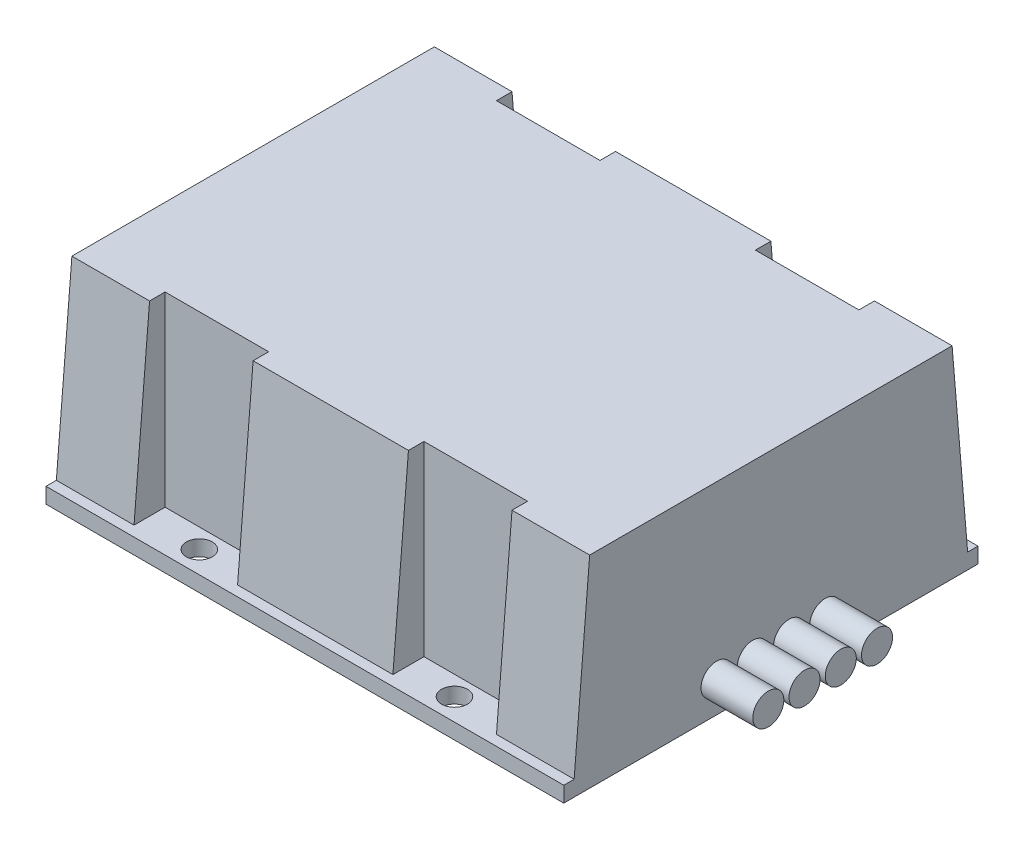
ISO-10303-21;
HEADER;
FILE_DESCRIPTION(('STEP AP214'),'2;1');
FILE_NAME('part.step','',(''),(''),'','','');
FILE_SCHEMA(('AUTOMOTIVE_DESIGN { 1 0 10303 214 1 1 1 1 }'));
ENDSEC;
DATA;
#1=APPLICATION_CONTEXT('core data for automotive mechanical design processes');
#2=APPLICATION_PROTOCOL_DEFINITION('international standard','automotive_design',2000,#1);
#3=PRODUCT_CONTEXT('',#1,'mechanical');
#4=PRODUCT('Part','Part','',(#3));
#5=PRODUCT_RELATED_PRODUCT_CATEGORY('part','',(#4));
#6=PRODUCT_DEFINITION_FORMATION('','',#4);
#7=PRODUCT_DEFINITION_CONTEXT('part definition',#1,'design');
#8=PRODUCT_DEFINITION('design','',#6,#7);
#9=PRODUCT_DEFINITION_SHAPE('','',#8);
#10=(LENGTH_UNIT() NAMED_UNIT(*) SI_UNIT(.MILLI.,.METRE.));
#11=(NAMED_UNIT(*) PLANE_ANGLE_UNIT() SI_UNIT($,.RADIAN.));
#12=(NAMED_UNIT(*) SI_UNIT($,.STERADIAN.) SOLID_ANGLE_UNIT());
#13=UNCERTAINTY_MEASURE_WITH_UNIT(LENGTH_MEASURE(1.E-05),#10,'distance_accuracy_value','');
#14=(GEOMETRIC_REPRESENTATION_CONTEXT(3) GLOBAL_UNCERTAINTY_ASSIGNED_CONTEXT((#13)) GLOBAL_UNIT_ASSIGNED_CONTEXT((#10,
#11,#12)) REPRESENTATION_CONTEXT('',''));
#15=CARTESIAN_POINT('',(0.,0.,0.));
#16=DIRECTION('',(0.,0.,1.));
#17=DIRECTION('',(1.,0.,0.));
#18=AXIS2_PLACEMENT_3D('',#15,#16,#17);
#19=CARTESIAN_POINT('',(0.,39.,0.));
#20=DIRECTION('',(0.,1.,0.));
#21=DIRECTION('',(0.,0.,1.));
#22=AXIS2_PLACEMENT_3D('',#19,#20,#21);
#23=PLANE('',#22);
#24=DIRECTION('',(1.,0.,0.));
#25=VECTOR('',#24,1.);
#26=CARTESIAN_POINT('',(0.,39.,72.));
#27=LINE('',#26,#25);
#28=CARTESIAN_POINT('',(15.,39.,72.));
#29=VERTEX_POINT('',#28);
#30=CARTESIAN_POINT('',(35.,39.,72.));
#31=VERTEX_POINT('',#30);
#32=EDGE_CURVE('E218',#29,#31,#27,.T.);
#33=ORIENTED_EDGE('',*,*,#32,.T.);
#34=DIRECTION('',(0.,0.,1.));
#35=VECTOR('',#34,1.);
#36=CARTESIAN_POINT('',(35.,39.,0.));
#37=LINE('',#36,#35);
#38=CARTESIAN_POINT('',(35.,39.,75.));
#39=VERTEX_POINT('',#38);
#40=EDGE_CURVE('E212',#31,#39,#37,.T.);
#41=ORIENTED_EDGE('',*,*,#40,.T.);
#42=DIRECTION('',(1.,0.,0.));
#43=VECTOR('',#42,1.);
#44=CARTESIAN_POINT('',(0.,39.,75.));
#45=LINE('',#44,#43);
#46=CARTESIAN_POINT('',(65.,39.,75.));
#47=VERTEX_POINT('',#46);
#48=EDGE_CURVE('E386',#39,#47,#45,.T.);
#49=ORIENTED_EDGE('',*,*,#48,.T.);
#50=DIRECTION('',(0.,0.,1.));
#51=VECTOR('',#50,1.);
#52=CARTESIAN_POINT('',(65.,39.,0.));
#53=LINE('',#52,#51);
#54=CARTESIAN_POINT('',(65.,39.,72.));
#55=VERTEX_POINT('',#54);
#56=EDGE_CURVE('E232',#55,#47,#53,.T.);
#57=ORIENTED_EDGE('',*,*,#56,.F.);
#58=DIRECTION('',(-1.,0.,0.));
#59=VECTOR('',#58,1.);
#60=CARTESIAN_POINT('',(0.,39.,72.));
#61=LINE('',#60,#59);
#62=CARTESIAN_POINT('',(85.,39.,72.));
#63=VERTEX_POINT('',#62);
#64=EDGE_CURVE('E240',#63,#55,#61,.T.);
#65=ORIENTED_EDGE('',*,*,#64,.F.);
#66=DIRECTION('',(0.,0.,1.));
#67=VECTOR('',#66,1.);
#68=CARTESIAN_POINT('',(85.,39.,0.));
#69=LINE('',#68,#67);
#70=CARTESIAN_POINT('',(85.,39.,75.));
#71=VERTEX_POINT('',#70);
#72=EDGE_CURVE('E227',#63,#71,#69,.T.);
#73=ORIENTED_EDGE('',*,*,#72,.T.);
#74=CARTESIAN_POINT('',(100.,39.,75.));
#75=VERTEX_POINT('',#74);
#76=EDGE_CURVE('E381',#71,#75,#45,.T.);
#77=ORIENTED_EDGE('',*,*,#76,.T.);
#78=DIRECTION('',(0.,0.,-1.));
#79=VECTOR('',#78,1.);
#80=CARTESIAN_POINT('',(100.,39.,0.));
#81=LINE('',#80,#79);
#82=CARTESIAN_POINT('',(100.,39.,5.));
#83=VERTEX_POINT('',#82);
#84=EDGE_CURVE('E347',#75,#83,#81,.T.);
#85=ORIENTED_EDGE('',*,*,#84,.T.);
#86=DIRECTION('',(1.,0.,0.));
#87=VECTOR('',#86,1.);
#88=CARTESIAN_POINT('',(-900.,39.,5.00000000000017));
#89=LINE('',#88,#87);
#90=CARTESIAN_POINT('',(85.,39.,5.));
#91=VERTEX_POINT('',#90);
#92=EDGE_CURVE('E300',#91,#83,#89,.T.);
#93=ORIENTED_EDGE('',*,*,#92,.F.);
#94=DIRECTION('',(0.,0.,-1.));
#95=VECTOR('',#94,1.);
#96=CARTESIAN_POINT('',(85.,39.,0.));
#97=LINE('',#96,#95);
#98=CARTESIAN_POINT('',(85.,39.,8.00000000000001));
#99=VERTEX_POINT('',#98);
#100=EDGE_CURVE('E252',#99,#91,#97,.T.);
#101=ORIENTED_EDGE('',*,*,#100,.F.);
#102=DIRECTION('',(-1.,0.,0.));
#103=VECTOR('',#102,1.);
#104=CARTESIAN_POINT('',(0.,39.,8.00000000000002));
#105=LINE('',#104,#103);
#106=CARTESIAN_POINT('',(65.,39.,8.00000000000001));
#107=VERTEX_POINT('',#106);
#108=EDGE_CURVE('E259',#99,#107,#105,.T.);
#109=ORIENTED_EDGE('',*,*,#108,.T.);
#110=DIRECTION('',(0.,0.,-1.));
#111=VECTOR('',#110,1.);
#112=CARTESIAN_POINT('',(65.,39.,0.));
#113=LINE('',#112,#111);
#114=CARTESIAN_POINT('',(65.,39.,5.));
#115=VERTEX_POINT('',#114);
#116=EDGE_CURVE('E247',#107,#115,#113,.T.);
#117=ORIENTED_EDGE('',*,*,#116,.T.);
#118=CARTESIAN_POINT('',(35.,39.,5.00000000000001));
#119=VERTEX_POINT('',#118);
#120=EDGE_CURVE('E310',#119,#115,#89,.T.);
#121=ORIENTED_EDGE('',*,*,#120,.F.);
#122=DIRECTION('',(0.,0.,-1.));
#123=VECTOR('',#122,1.);
#124=CARTESIAN_POINT('',(35.,39.,0.));
#125=LINE('',#124,#123);
#126=CARTESIAN_POINT('',(35.,39.,8.00000000000002));
#127=VERTEX_POINT('',#126);
#128=EDGE_CURVE('E275',#127,#119,#125,.T.);
#129=ORIENTED_EDGE('',*,*,#128,.F.);
#130=DIRECTION('',(-1.,0.,0.));
#131=VECTOR('',#130,1.);
#132=CARTESIAN_POINT('',(0.,39.,8.00000000000002));
#133=LINE('',#132,#131);
#134=CARTESIAN_POINT('',(15.,39.,8.00000000000002));
#135=VERTEX_POINT('',#134);
#136=EDGE_CURVE('E282',#127,#135,#133,.T.);
#137=ORIENTED_EDGE('',*,*,#136,.T.);
#138=DIRECTION('',(0.,0.,-1.));
#139=VECTOR('',#138,1.);
#140=CARTESIAN_POINT('',(15.,39.,0.));
#141=LINE('',#140,#139);
#142=CARTESIAN_POINT('',(15.,39.,5.00000000000001));
#143=VERTEX_POINT('',#142);
#144=EDGE_CURVE('E271',#135,#143,#141,.T.);
#145=ORIENTED_EDGE('',*,*,#144,.T.);
#146=CARTESIAN_POINT('',(0.,39.,5.00000000000002));
#147=VERTEX_POINT('',#146);
#148=EDGE_CURVE('E307',#147,#143,#89,.T.);
#149=ORIENTED_EDGE('',*,*,#148,.F.);
#150=DIRECTION('',(0.,0.,1.));
#151=VECTOR('',#150,1.);
#152=CARTESIAN_POINT('',(0.,39.,0.));
#153=LINE('',#152,#151);
#154=CARTESIAN_POINT('',(0.,39.,75.));
#155=VERTEX_POINT('',#154);
#156=EDGE_CURVE('E345',#147,#155,#153,.T.);
#157=ORIENTED_EDGE('',*,*,#156,.T.);
#158=CARTESIAN_POINT('',(15.,39.,75.));
#159=VERTEX_POINT('',#158);
#160=EDGE_CURVE('E382',#155,#159,#45,.T.);
#161=ORIENTED_EDGE('',*,*,#160,.T.);
#162=DIRECTION('',(0.,0.,1.));
#163=VECTOR('',#162,1.);
#164=CARTESIAN_POINT('',(15.,39.,0.));
#165=LINE('',#164,#163);
#166=EDGE_CURVE('E216',#29,#159,#165,.T.);
#167=ORIENTED_EDGE('',*,*,#166,.F.);
#168=EDGE_LOOP('',(#33,#41,#49,#57,#65,#73,#77,#85,#93,#101,#109,#117,#121,#129,#137,#145,#149,
#157,#161,#167));
#169=FACE_BOUND('',#168,.T.);
#170=ADVANCED_FACE('F37',(#169),#23,.T.);
#171=CARTESIAN_POINT('',(-900.,6.47586206896553,77.7103448275864));
#172=DIRECTION('',(0.,0.0830454798537401,0.99654575824488));
#173=DIRECTION('',(0.,-0.99654575824488,0.0830454798537401));
#174=AXIS2_PLACEMENT_3D('',#171,#172,#173);
#175=PLANE('',#174);
#176=ORIENTED_EDGE('',*,*,#48,.F.);
#177=DIRECTION('',(0.,-0.99654575824488,0.0830454798537401));
#178=VECTOR('',#177,1.);
#179=CARTESIAN_POINT('',(35.,6.47586206896551,77.7103448275862));
#180=LINE('',#179,#178);
#181=CARTESIAN_POINT('',(35.,3.,78.));
#182=VERTEX_POINT('',#181);
#183=EDGE_CURVE('E11',#39,#182,#180,.T.);
#184=ORIENTED_EDGE('',*,*,#183,.T.);
#185=DIRECTION('',(1.,0.,0.));
#186=VECTOR('',#185,1.);
#187=CARTESIAN_POINT('',(-900.,3.,78.0000000000002));
#188=LINE('',#187,#186);
#189=CARTESIAN_POINT('',(65.0000000000001,3.,78.));
#190=VERTEX_POINT('',#189);
#191=EDGE_CURVE('E59',#182,#190,#188,.T.);
#192=ORIENTED_EDGE('',*,*,#191,.T.);
#193=DIRECTION('',(0.,-0.99654575824488,0.0830454798537401));
#194=VECTOR('',#193,1.);
#195=CARTESIAN_POINT('',(65.0000000000001,6.47586206896551,77.7103448275862));
#196=LINE('',#195,#194);
#197=EDGE_CURVE('E388',#47,#190,#196,.T.);
#198=ORIENTED_EDGE('',*,*,#197,.F.);
#199=EDGE_LOOP('',(#176,#184,#192,#198));
#200=FACE_BOUND('',#199,.T.);
#201=ADVANCED_FACE('F439',(#200),#175,.T.);
#202=ORIENTED_EDGE('',*,*,#76,.F.);
#203=DIRECTION('',(0.,-0.99654575824488,0.0830454798537401));
#204=VECTOR('',#203,1.);
#205=CARTESIAN_POINT('',(85.,6.47586206896551,77.7103448275862));
#206=LINE('',#205,#204);
#207=CARTESIAN_POINT('',(85.,3.,78.));
#208=VERTEX_POINT('',#207);
#209=EDGE_CURVE('E391',#71,#208,#206,.T.);
#210=ORIENTED_EDGE('',*,*,#209,.T.);
#211=CARTESIAN_POINT('',(100.,3.,78.));
#212=VERTEX_POINT('',#211);
#213=EDGE_CURVE('E326',#208,#212,#188,.T.);
#214=ORIENTED_EDGE('',*,*,#213,.T.);
#215=DIRECTION('',(0.,-0.99654575824488,0.0830454798537401));
#216=VECTOR('',#215,1.);
#217=CARTESIAN_POINT('',(100.,6.47586206896553,77.7103448275862));
#218=LINE('',#217,#216);
#219=EDGE_CURVE('E315',#75,#212,#218,.T.);
#220=ORIENTED_EDGE('',*,*,#219,.F.);
#221=EDGE_LOOP('',(#202,#210,#214,#220));
#222=FACE_BOUND('',#221,.T.);
#223=ADVANCED_FACE('F426',(#222),#175,.T.);
#224=CARTESIAN_POINT('',(-900.,-0.144827586206898,1.73793103448293));
#225=DIRECTION('',(0.,-0.08304547985374,0.99654575824488));
#226=DIRECTION('',(0.,-0.99654575824488,-0.08304547985374));
#227=AXIS2_PLACEMENT_3D('',#224,#225,#226);
#228=PLANE('',#227);
#229=DIRECTION('',(0.,0.99654575824488,0.08304547985374));
#230=VECTOR('',#229,1.);
#231=CARTESIAN_POINT('',(65.0000000000001,-0.144827586206884,1.73793103448276));
#232=LINE('',#231,#230);
#233=CARTESIAN_POINT('',(65.,3.,2.));
#234=VERTEX_POINT('',#233);
#235=EDGE_CURVE('E269',#234,#115,#232,.T.);
#236=ORIENTED_EDGE('',*,*,#235,.F.);
#237=DIRECTION('',(1.,0.,0.));
#238=VECTOR('',#237,1.);
#239=CARTESIAN_POINT('',(-900.,3.,2.00000000000017));
#240=LINE('',#239,#238);
#241=CARTESIAN_POINT('',(35.,3.,2.00000000000001));
#242=VERTEX_POINT('',#241);
#243=EDGE_CURVE('E305',#242,#234,#240,.T.);
#244=ORIENTED_EDGE('',*,*,#243,.F.);
#245=DIRECTION('',(0.,0.99654575824488,0.08304547985374));
#246=VECTOR('',#245,1.);
#247=CARTESIAN_POINT('',(35.,-0.144827586206885,1.73793103448277));
#248=LINE('',#247,#246);
#249=EDGE_CURVE('E288',#242,#119,#248,.T.);
#250=ORIENTED_EDGE('',*,*,#249,.T.);
#251=ORIENTED_EDGE('',*,*,#120,.T.);
#252=EDGE_LOOP('',(#236,#244,#250,#251));
#253=FACE_BOUND('',#252,.T.);
#254=ADVANCED_FACE('F565',(#253),#228,.F.);
#255=DIRECTION('',(0.,0.99654575824488,0.08304547985374));
#256=VECTOR('',#255,1.);
#257=CARTESIAN_POINT('',(15.,-0.144827586206885,1.73793103448277));
#258=LINE('',#257,#256);
#259=CARTESIAN_POINT('',(15.,3.,2.00000000000002));
#260=VERTEX_POINT('',#259);
#261=EDGE_CURVE('E292',#260,#143,#258,.T.);
#262=ORIENTED_EDGE('',*,*,#261,.F.);
#263=CARTESIAN_POINT('',(0.,3.,2.00000000000002));
#264=VERTEX_POINT('',#263);
#265=EDGE_CURVE('E301',#264,#260,#240,.T.);
#266=ORIENTED_EDGE('',*,*,#265,.F.);
#267=DIRECTION('',(0.,-0.99654575824488,-0.08304547985374));
#268=VECTOR('',#267,1.);
#269=CARTESIAN_POINT('',(0.,38.5862068965517,4.96551724137933));
#270=LINE('',#269,#268);
#271=EDGE_CURVE('E312',#147,#264,#270,.T.);
#272=ORIENTED_EDGE('',*,*,#271,.F.);
#273=ORIENTED_EDGE('',*,*,#148,.T.);
#274=EDGE_LOOP('',(#262,#266,#272,#273));
#275=FACE_BOUND('',#274,.T.);
#276=ADVANCED_FACE('F445',(#275),#228,.F.);
#277=CARTESIAN_POINT('',(100.,39.,0.));
#278=DIRECTION('',(-1.,0.,0.));
#279=DIRECTION('',(0.,0.,1.));
#280=AXIS2_PLACEMENT_3D('',#277,#278,#279);
#281=PLANE('',#280);
#282=CARTESIAN_POINT('',(100.,6.,36.5));
#283=DIRECTION('',(-1.,0.,0.));
#284=DIRECTION('',(0.,0.,1.));
#285=AXIS2_PLACEMENT_3D('',#282,#283,#284);
#286=CIRCLE('',#285,3.00000000000001);
#287=CARTESIAN_POINT('',(100.,6.,39.5));
#288=VERTEX_POINT('',#287);
#289=EDGE_CURVE('E375',#288,#288,#286,.F.);
#290=ORIENTED_EDGE('',*,*,#289,.F.);
#291=EDGE_LOOP('',(#290));
#292=FACE_BOUND('',#291,.T.);
#293=CARTESIAN_POINT('',(100.,6.,50.5));
#294=DIRECTION('',(-1.,0.,0.));
#295=DIRECTION('',(0.,0.,1.));
#296=AXIS2_PLACEMENT_3D('',#293,#294,#295);
#297=CIRCLE('',#296,3.00000000000001);
#298=CARTESIAN_POINT('',(100.,6.,53.5));
#299=VERTEX_POINT('',#298);
#300=EDGE_CURVE('E369',#299,#299,#297,.F.);
#301=ORIENTED_EDGE('',*,*,#300,.F.);
#302=EDGE_LOOP('',(#301));
#303=FACE_BOUND('',#302,.T.);
#304=CARTESIAN_POINT('',(100.,6.,43.5));
#305=DIRECTION('',(-1.,0.,0.));
#306=DIRECTION('',(0.,0.,1.));
#307=AXIS2_PLACEMENT_3D('',#304,#305,#306);
#308=CIRCLE('',#307,2.99999999999999);
#309=CARTESIAN_POINT('',(100.,6.,46.5));
#310=VERTEX_POINT('',#309);
#311=EDGE_CURVE('E372',#310,#310,#308,.F.);
#312=ORIENTED_EDGE('',*,*,#311,.F.);
#313=EDGE_LOOP('',(#312));
#314=FACE_BOUND('',#313,.T.);
#315=CARTESIAN_POINT('',(100.,6.,29.5));
#316=DIRECTION('',(-1.,0.,0.));
#317=DIRECTION('',(0.,0.,1.));
#318=AXIS2_PLACEMENT_3D('',#315,#316,#317);
#319=CIRCLE('',#318,3.);
#320=CARTESIAN_POINT('',(100.,6.,32.5));
#321=VERTEX_POINT('',#320);
#322=EDGE_CURVE('E378',#321,#321,#319,.F.);
#323=ORIENTED_EDGE('',*,*,#322,.F.);
#324=EDGE_LOOP('',(#323));
#325=FACE_BOUND('',#324,.T.);
#326=DIRECTION('',(0.,0.,1.));
#327=VECTOR('',#326,1.);
#328=CARTESIAN_POINT('',(100.,3.,0.));
#329=LINE('',#328,#327);
#330=CARTESIAN_POINT('',(100.,3.,0.));
#331=VERTEX_POINT('',#330);
#332=CARTESIAN_POINT('',(100.,3.,2.));
#333=VERTEX_POINT('',#332);
#334=EDGE_CURVE('E297',#331,#333,#329,.T.);
#335=ORIENTED_EDGE('',*,*,#334,.T.);
#336=DIRECTION('',(0.,-0.99654575824488,-0.08304547985374));
#337=VECTOR('',#336,1.);
#338=CARTESIAN_POINT('',(100.,-0.144827586206898,1.73793103448276));
#339=LINE('',#338,#337);
#340=EDGE_CURVE('E294',#83,#333,#339,.T.);
#341=ORIENTED_EDGE('',*,*,#340,.F.);
#342=ORIENTED_EDGE('',*,*,#84,.F.);
#343=ORIENTED_EDGE('',*,*,#219,.T.);
#344=DIRECTION('',(0.,0.,-1.));
#345=VECTOR('',#344,1.);
#346=CARTESIAN_POINT('',(100.,3.,0.));
#347=LINE('',#346,#345);
#348=CARTESIAN_POINT('',(100.,3.,80.));
#349=VERTEX_POINT('',#348);
#350=EDGE_CURVE('E318',#349,#212,#347,.T.);
#351=ORIENTED_EDGE('',*,*,#350,.F.);
#352=DIRECTION('',(0.,-1.,0.));
#353=VECTOR('',#352,1.);
#354=CARTESIAN_POINT('',(100.,39.,80.));
#355=LINE('',#354,#353);
#356=CARTESIAN_POINT('',(100.,0.,80.));
#357=VERTEX_POINT('',#356);
#358=EDGE_CURVE('E365',#349,#357,#355,.T.);
#359=ORIENTED_EDGE('',*,*,#358,.T.);
#360=DIRECTION('',(0.,0.,-1.));
#361=VECTOR('',#360,1.);
#362=CARTESIAN_POINT('',(100.,0.,0.));
#363=LINE('',#362,#361);
#364=CARTESIAN_POINT('',(100.,0.,0.));
#365=VERTEX_POINT('',#364);
#366=EDGE_CURVE('E357',#357,#365,#363,.T.);
#367=ORIENTED_EDGE('',*,*,#366,.T.);
#368=DIRECTION('',(0.,-1.,0.));
#369=VECTOR('',#368,1.);
#370=CARTESIAN_POINT('',(100.,39.,0.));
#371=LINE('',#370,#369);
#372=EDGE_CURVE('E363',#331,#365,#371,.T.);
#373=ORIENTED_EDGE('',*,*,#372,.F.);
#374=EDGE_LOOP('',(#335,#341,#342,#343,#351,#359,#367,#373));
#375=FACE_BOUND('',#374,.T.);
#376=ADVANCED_FACE('F417',(#292,#303,#314,#325,#375),#281,.F.);
#377=CARTESIAN_POINT('',(0.,39.,0.));
#378=DIRECTION('',(1.,0.,0.));
#379=DIRECTION('',(0.,0.,-1.));
#380=AXIS2_PLACEMENT_3D('',#377,#378,#379);
#381=PLANE('',#380);
#382=DIRECTION('',(0.,0.,1.));
#383=VECTOR('',#382,1.);
#384=CARTESIAN_POINT('',(0.,3.,0.));
#385=LINE('',#384,#383);
#386=CARTESIAN_POINT('',(0.,3.,0.));
#387=VERTEX_POINT('',#386);
#388=EDGE_CURVE('E304',#387,#264,#385,.T.);
#389=ORIENTED_EDGE('',*,*,#388,.F.);
#390=DIRECTION('',(0.,-1.,0.));
#391=VECTOR('',#390,1.);
#392=CARTESIAN_POINT('',(0.,39.,0.));
#393=LINE('',#392,#391);
#394=CARTESIAN_POINT('',(0.,0.,0.));
#395=VERTEX_POINT('',#394);
#396=EDGE_CURVE('E351',#387,#395,#393,.T.);
#397=ORIENTED_EDGE('',*,*,#396,.T.);
#398=DIRECTION('',(0.,0.,1.));
#399=VECTOR('',#398,1.);
#400=CARTESIAN_POINT('',(0.,0.,0.));
#401=LINE('',#400,#399);
#402=CARTESIAN_POINT('',(0.,0.,80.));
#403=VERTEX_POINT('',#402);
#404=EDGE_CURVE('E344',#395,#403,#401,.T.);
#405=ORIENTED_EDGE('',*,*,#404,.T.);
#406=DIRECTION('',(0.,-1.,0.));
#407=VECTOR('',#406,1.);
#408=CARTESIAN_POINT('',(0.,39.,80.));
#409=LINE('',#408,#407);
#410=CARTESIAN_POINT('',(0.,3.,80.));
#411=VERTEX_POINT('',#410);
#412=EDGE_CURVE('E367',#411,#403,#409,.T.);
#413=ORIENTED_EDGE('',*,*,#412,.F.);
#414=DIRECTION('',(0.,0.,-1.));
#415=VECTOR('',#414,1.);
#416=CARTESIAN_POINT('',(0.,3.,0.));
#417=LINE('',#416,#415);
#418=CARTESIAN_POINT('',(0.,3.,78.));
#419=VERTEX_POINT('',#418);
#420=EDGE_CURVE('E329',#411,#419,#417,.T.);
#421=ORIENTED_EDGE('',*,*,#420,.T.);
#422=DIRECTION('',(0.,-0.99654575824488,0.0830454798537401));
#423=VECTOR('',#422,1.);
#424=CARTESIAN_POINT('',(0.,45.2068965517241,74.4827586206897));
#425=LINE('',#424,#423);
#426=EDGE_CURVE('E325',#155,#419,#425,.T.);
#427=ORIENTED_EDGE('',*,*,#426,.F.);
#428=ORIENTED_EDGE('',*,*,#156,.F.);
#429=ORIENTED_EDGE('',*,*,#271,.T.);
#430=EDGE_LOOP('',(#389,#397,#405,#413,#421,#427,#428,#429));
#431=FACE_BOUND('',#430,.T.);
#432=ADVANCED_FACE('F39',(#431),#381,.F.);
#433=CARTESIAN_POINT('',(0.,39.,0.));
#434=DIRECTION('',(0.,0.,1.));
#435=DIRECTION('',(1.,0.,0.));
#436=AXIS2_PLACEMENT_3D('',#433,#434,#435);
#437=PLANE('',#436);
#438=DIRECTION('',(-1.,0.,0.));
#439=VECTOR('',#438,1.);
#440=CARTESIAN_POINT('',(0.,3.,0.));
#441=LINE('',#440,#439);
#442=EDGE_CURVE('E385',#331,#387,#441,.T.);
#443=ORIENTED_EDGE('',*,*,#442,.F.);
#444=ORIENTED_EDGE('',*,*,#372,.T.);
#445=DIRECTION('',(-1.,0.,0.));
#446=VECTOR('',#445,1.);
#447=CARTESIAN_POINT('',(0.,0.,0.));
#448=LINE('',#447,#446);
#449=EDGE_CURVE('E348',#365,#395,#448,.T.);
#450=ORIENTED_EDGE('',*,*,#449,.T.);
#451=ORIENTED_EDGE('',*,*,#396,.F.);
#452=EDGE_LOOP('',(#443,#444,#450,#451));
#453=FACE_BOUND('',#452,.T.);
#454=ADVANCED_FACE('F452',(#453),#437,.F.);
#455=CARTESIAN_POINT('',(0.,39.,80.));
#456=DIRECTION('',(0.,0.,-1.));
#457=DIRECTION('',(-1.,0.,0.));
#458=AXIS2_PLACEMENT_3D('',#455,#456,#457);
#459=PLANE('',#458);
#460=ORIENTED_EDGE('',*,*,#358,.F.);
#461=DIRECTION('',(1.,0.,0.));
#462=VECTOR('',#461,1.);
#463=CARTESIAN_POINT('',(-900.,3.,80.0000000000002));
#464=LINE('',#463,#462);
#465=EDGE_CURVE('E321',#411,#349,#464,.T.);
#466=ORIENTED_EDGE('',*,*,#465,.F.);
#467=ORIENTED_EDGE('',*,*,#412,.T.);
#468=DIRECTION('',(1.,0.,0.));
#469=VECTOR('',#468,1.);
#470=CARTESIAN_POINT('',(0.,0.,80.));
#471=LINE('',#470,#469);
#472=EDGE_CURVE('E354',#403,#357,#471,.T.);
#473=ORIENTED_EDGE('',*,*,#472,.T.);
#474=EDGE_LOOP('',(#460,#466,#467,#473));
#475=FACE_BOUND('',#474,.T.);
#476=ADVANCED_FACE('F410',(#475),#459,.F.);
#477=CARTESIAN_POINT('',(0.,0.,0.));
#478=DIRECTION('',(0.,1.,0.));
#479=DIRECTION('',(0.,0.,1.));
#480=AXIS2_PLACEMENT_3D('',#477,#478,#479);
#481=PLANE('',#480);
#482=CARTESIAN_POINT('',(74.6412589685258,0.,75.7482062948426));
#483=DIRECTION('',(0.,1.,0.));
#484=DIRECTION('',(0.,0.,1.));
#485=AXIS2_PLACEMENT_3D('',#482,#483,#484);
#486=CIRCLE('',#485,2.50000000000001);
#487=CARTESIAN_POINT('',(74.6412589685258,0.,78.2482062948426));
#488=VERTEX_POINT('',#487);
#489=EDGE_CURVE('E480',#488,#488,#486,.T.);
#490=ORIENTED_EDGE('',*,*,#489,.T.);
#491=EDGE_LOOP('',(#490));
#492=FACE_BOUND('',#491,.T.);
#493=CARTESIAN_POINT('',(75.,0.,4.00000000000001));
#494=DIRECTION('',(0.,1.,0.));
#495=DIRECTION('',(0.,0.,1.));
#496=AXIS2_PLACEMENT_3D('',#493,#494,#495);
#497=CIRCLE('',#496,2.5);
#498=CARTESIAN_POINT('',(75.,0.,6.50000000000001));
#499=VERTEX_POINT('',#498);
#500=EDGE_CURVE('E484',#499,#499,#497,.T.);
#501=ORIENTED_EDGE('',*,*,#500,.T.);
#502=EDGE_LOOP('',(#501));
#503=FACE_BOUND('',#502,.T.);
#504=CARTESIAN_POINT('',(25.,0.,4.00000000000002));
#505=DIRECTION('',(0.,1.,0.));
#506=DIRECTION('',(0.,0.,1.));
#507=AXIS2_PLACEMENT_3D('',#504,#505,#506);
#508=CIRCLE('',#507,2.5);
#509=CARTESIAN_POINT('',(25.,0.,6.50000000000001));
#510=VERTEX_POINT('',#509);
#511=EDGE_CURVE('E488',#510,#510,#508,.T.);
#512=ORIENTED_EDGE('',*,*,#511,.T.);
#513=EDGE_LOOP('',(#512));
#514=FACE_BOUND('',#513,.T.);
#515=CARTESIAN_POINT('',(25.3587410314742,0.,75.7482062948426));
#516=DIRECTION('',(0.,1.,0.));
#517=DIRECTION('',(0.,0.,1.));
#518=AXIS2_PLACEMENT_3D('',#515,#516,#517);
#519=CIRCLE('',#518,2.5);
#520=CARTESIAN_POINT('',(25.3587410314742,0.,78.2482062948426));
#521=VERTEX_POINT('',#520);
#522=EDGE_CURVE('E221',#521,#521,#519,.T.);
#523=ORIENTED_EDGE('',*,*,#522,.T.);
#524=EDGE_LOOP('',(#523));
#525=FACE_BOUND('',#524,.T.);
#526=ORIENTED_EDGE('',*,*,#404,.F.);
#527=ORIENTED_EDGE('',*,*,#449,.F.);
#528=ORIENTED_EDGE('',*,*,#366,.F.);
#529=ORIENTED_EDGE('',*,*,#472,.F.);
#530=EDGE_LOOP('',(#526,#527,#528,#529));
#531=FACE_BOUND('',#530,.T.);
#532=ADVANCED_FACE('F413',(#492,#503,#514,#525,#531),#481,.F.);
#533=CARTESIAN_POINT('',(110.,6.,50.5));
#534=DIRECTION('',(-1.,0.,0.));
#535=DIRECTION('',(0.,0.,1.));
#536=AXIS2_PLACEMENT_3D('',#533,#534,#535);
#537=CYLINDRICAL_SURFACE('',#536,3.00000000000001);
#538=CARTESIAN_POINT('',(110.,6.,50.5));
#539=DIRECTION('',(1.,0.,0.));
#540=DIRECTION('',(0.,0.,-1.));
#541=AXIS2_PLACEMENT_3D('',#538,#539,#540);
#542=CIRCLE('',#541,3.00000000000001);
#543=CARTESIAN_POINT('',(110.,6.,47.5));
#544=VERTEX_POINT('',#543);
#545=EDGE_CURVE('E341',#544,#544,#542,.T.);
#546=ORIENTED_EDGE('',*,*,#545,.F.);
#547=EDGE_LOOP('',(#546));
#548=FACE_BOUND('',#547,.T.);
#549=ORIENTED_EDGE('',*,*,#300,.T.);
#550=EDGE_LOOP('',(#549));
#551=FACE_BOUND('',#550,.T.);
#552=ADVANCED_FACE('F468',(#548,#551),#537,.T.);
#553=CARTESIAN_POINT('',(110.,6.,50.5));
#554=DIRECTION('',(1.,0.,0.));
#555=DIRECTION('',(0.,0.,-1.));
#556=AXIS2_PLACEMENT_3D('',#553,#554,#555);
#557=PLANE('',#556);
#558=ORIENTED_EDGE('',*,*,#545,.T.);
#559=EDGE_LOOP('',(#558));
#560=FACE_BOUND('',#559,.T.);
#561=ADVANCED_FACE('F475',(#560),#557,.T.);
#562=CARTESIAN_POINT('',(110.,6.,43.5));
#563=DIRECTION('',(-1.,0.,0.));
#564=DIRECTION('',(0.,0.,1.));
#565=AXIS2_PLACEMENT_3D('',#562,#563,#564);
#566=CYLINDRICAL_SURFACE('',#565,2.99999999999999);
#567=CARTESIAN_POINT('',(110.,6.,43.5));
#568=DIRECTION('',(1.,0.,0.));
#569=DIRECTION('',(0.,0.,-1.));
#570=AXIS2_PLACEMENT_3D('',#567,#568,#569);
#571=CIRCLE('',#570,2.99999999999999);
#572=CARTESIAN_POINT('',(110.,6.,40.5));
#573=VERTEX_POINT('',#572);
#574=EDGE_CURVE('E338',#573,#573,#571,.T.);
#575=ORIENTED_EDGE('',*,*,#574,.F.);
#576=EDGE_LOOP('',(#575));
#577=FACE_BOUND('',#576,.T.);
#578=ORIENTED_EDGE('',*,*,#311,.T.);
#579=EDGE_LOOP('',(#578));
#580=FACE_BOUND('',#579,.T.);
#581=ADVANCED_FACE('F542',(#577,#580),#566,.T.);
#582=CARTESIAN_POINT('',(110.,6.,43.5));
#583=DIRECTION('',(1.,0.,0.));
#584=DIRECTION('',(0.,0.,-1.));
#585=AXIS2_PLACEMENT_3D('',#582,#583,#584);
#586=PLANE('',#585);
#587=ORIENTED_EDGE('',*,*,#574,.T.);
#588=EDGE_LOOP('',(#587));
#589=FACE_BOUND('',#588,.T.);
#590=ADVANCED_FACE('F538',(#589),#586,.T.);
#591=CARTESIAN_POINT('',(110.,6.,36.5));
#592=DIRECTION('',(-1.,0.,0.));
#593=DIRECTION('',(0.,0.,1.));
#594=AXIS2_PLACEMENT_3D('',#591,#592,#593);
#595=CYLINDRICAL_SURFACE('',#594,3.00000000000001);
#596=CARTESIAN_POINT('',(110.,6.,36.5));
#597=DIRECTION('',(1.,0.,0.));
#598=DIRECTION('',(0.,0.,-1.));
#599=AXIS2_PLACEMENT_3D('',#596,#597,#598);
#600=CIRCLE('',#599,3.00000000000001);
#601=CARTESIAN_POINT('',(110.,6.,33.5));
#602=VERTEX_POINT('',#601);
#603=EDGE_CURVE('E335',#602,#602,#600,.T.);
#604=ORIENTED_EDGE('',*,*,#603,.F.);
#605=EDGE_LOOP('',(#604));
#606=FACE_BOUND('',#605,.T.);
#607=ORIENTED_EDGE('',*,*,#289,.T.);
#608=EDGE_LOOP('',(#607));
#609=FACE_BOUND('',#608,.T.);
#610=ADVANCED_FACE('F534',(#606,#609),#595,.T.);
#611=CARTESIAN_POINT('',(110.,6.,36.5));
#612=DIRECTION('',(1.,0.,0.));
#613=DIRECTION('',(0.,0.,-1.));
#614=AXIS2_PLACEMENT_3D('',#611,#612,#613);
#615=PLANE('',#614);
#616=ORIENTED_EDGE('',*,*,#603,.T.);
#617=EDGE_LOOP('',(#616));
#618=FACE_BOUND('',#617,.T.);
#619=ADVANCED_FACE('F530',(#618),#615,.T.);
#620=CARTESIAN_POINT('',(110.,6.,29.5));
#621=DIRECTION('',(-1.,0.,0.));
#622=DIRECTION('',(0.,0.,1.));
#623=AXIS2_PLACEMENT_3D('',#620,#621,#622);
#624=CYLINDRICAL_SURFACE('',#623,3.);
#625=CARTESIAN_POINT('',(110.,6.,29.5));
#626=DIRECTION('',(1.,0.,0.));
#627=DIRECTION('',(0.,0.,-1.));
#628=AXIS2_PLACEMENT_3D('',#625,#626,#627);
#629=CIRCLE('',#628,3.);
#630=CARTESIAN_POINT('',(110.,6.,26.5));
#631=VERTEX_POINT('',#630);
#632=EDGE_CURVE('E332',#631,#631,#629,.T.);
#633=ORIENTED_EDGE('',*,*,#632,.F.);
#634=EDGE_LOOP('',(#633));
#635=FACE_BOUND('',#634,.T.);
#636=ORIENTED_EDGE('',*,*,#322,.T.);
#637=EDGE_LOOP('',(#636));
#638=FACE_BOUND('',#637,.T.);
#639=ADVANCED_FACE('F522',(#635,#638),#624,.T.);
#640=CARTESIAN_POINT('',(110.,6.,29.5));
#641=DIRECTION('',(1.,0.,0.));
#642=DIRECTION('',(0.,0.,-1.));
#643=AXIS2_PLACEMENT_3D('',#640,#641,#642);
#644=PLANE('',#643);
#645=ORIENTED_EDGE('',*,*,#632,.T.);
#646=EDGE_LOOP('',(#645));
#647=FACE_BOUND('',#646,.T.);
#648=ADVANCED_FACE('F515',(#647),#644,.T.);
#649=CARTESIAN_POINT('',(-900.,3.,1.53466072639936E-13));
#650=DIRECTION('',(0.,-1.,0.));
#651=DIRECTION('',(0.,0.,-1.));
#652=AXIS2_PLACEMENT_3D('',#649,#650,#651);
#653=PLANE('',#652);
#654=CARTESIAN_POINT('',(74.6412589685258,3.,75.7482062948426));
#655=DIRECTION('',(0.,1.,0.));
#656=DIRECTION('',(0.,0.,1.));
#657=AXIS2_PLACEMENT_3D('',#654,#655,#656);
#658=CIRCLE('',#657,2.50000000000001);
#659=CARTESIAN_POINT('',(74.6412589685258,3.,78.2482062948426));
#660=VERTEX_POINT('',#659);
#661=EDGE_CURVE('E506',#660,#660,#658,.T.);
#662=ORIENTED_EDGE('',*,*,#661,.F.);
#663=EDGE_LOOP('',(#662));
#664=FACE_BOUND('',#663,.T.);
#665=CARTESIAN_POINT('',(25.3587410314742,3.,75.7482062948426));
#666=DIRECTION('',(0.,1.,0.));
#667=DIRECTION('',(0.,0.,-1.));
#668=AXIS2_PLACEMENT_3D('',#665,#666,#667);
#669=CIRCLE('',#668,2.5);
#670=CARTESIAN_POINT('',(25.3587410314742,3.,73.2482062948426));
#671=VERTEX_POINT('',#670);
#672=EDGE_CURVE('E492',#671,#671,#669,.T.);
#673=ORIENTED_EDGE('',*,*,#672,.F.);
#674=EDGE_LOOP('',(#673));
#675=FACE_BOUND('',#674,.T.);
#676=ORIENTED_EDGE('',*,*,#465,.T.);
#677=ORIENTED_EDGE('',*,*,#350,.T.);
#678=ORIENTED_EDGE('',*,*,#213,.F.);
#679=DIRECTION('',(0.,0.,1.));
#680=VECTOR('',#679,1.);
#681=CARTESIAN_POINT('',(85.,3.,0.));
#682=LINE('',#681,#680);
#683=CARTESIAN_POINT('',(85.,3.,72.));
#684=VERTEX_POINT('',#683);
#685=EDGE_CURVE('E229',#684,#208,#682,.T.);
#686=ORIENTED_EDGE('',*,*,#685,.F.);
#687=DIRECTION('',(-1.,0.,0.));
#688=VECTOR('',#687,1.);
#689=CARTESIAN_POINT('',(0.,3.,72.));
#690=LINE('',#689,#688);
#691=CARTESIAN_POINT('',(65.,3.,72.));
#692=VERTEX_POINT('',#691);
#693=EDGE_CURVE('E231',#684,#692,#690,.T.);
#694=ORIENTED_EDGE('',*,*,#693,.T.);
#695=DIRECTION('',(0.,0.,1.));
#696=VECTOR('',#695,1.);
#697=CARTESIAN_POINT('',(65.,3.,0.));
#698=LINE('',#697,#696);
#699=EDGE_CURVE('E235',#692,#190,#698,.T.);
#700=ORIENTED_EDGE('',*,*,#699,.T.);
#701=ORIENTED_EDGE('',*,*,#191,.F.);
#702=DIRECTION('',(0.,0.,1.));
#703=VECTOR('',#702,1.);
#704=CARTESIAN_POINT('',(35.,3.,0.));
#705=LINE('',#704,#703);
#706=CARTESIAN_POINT('',(35.,3.,72.));
#707=VERTEX_POINT('',#706);
#708=EDGE_CURVE('E207',#707,#182,#705,.T.);
#709=ORIENTED_EDGE('',*,*,#708,.F.);
#710=DIRECTION('',(1.,0.,0.));
#711=VECTOR('',#710,1.);
#712=CARTESIAN_POINT('',(0.,3.,72.));
#713=LINE('',#712,#711);
#714=CARTESIAN_POINT('',(15.,3.,72.));
#715=VERTEX_POINT('',#714);
#716=EDGE_CURVE('E199',#715,#707,#713,.T.);
#717=ORIENTED_EDGE('',*,*,#716,.F.);
#718=DIRECTION('',(0.,0.,1.));
#719=VECTOR('',#718,1.);
#720=CARTESIAN_POINT('',(15.,3.,0.));
#721=LINE('',#720,#719);
#722=CARTESIAN_POINT('',(15.,3.,78.));
#723=VERTEX_POINT('',#722);
#724=EDGE_CURVE('E52',#715,#723,#721,.T.);
#725=ORIENTED_EDGE('',*,*,#724,.T.);
#726=EDGE_CURVE('E322',#419,#723,#188,.T.);
#727=ORIENTED_EDGE('',*,*,#726,.F.);
#728=ORIENTED_EDGE('',*,*,#420,.F.);
#729=EDGE_LOOP('',(#676,#677,#678,#686,#694,#700,#701,#709,#717,#725,#727,#728));
#730=FACE_BOUND('',#729,.T.);
#731=ADVANCED_FACE('F215',(#664,#675,#730),#653,.F.);
#732=DIRECTION('',(0.,-0.99654575824488,0.0830454798537401));
#733=VECTOR('',#732,1.);
#734=CARTESIAN_POINT('',(15.,6.47586206896551,77.7103448275862));
#735=LINE('',#734,#733);
#736=EDGE_CURVE('E45',#159,#723,#735,.T.);
#737=ORIENTED_EDGE('',*,*,#736,.F.);
#738=ORIENTED_EDGE('',*,*,#160,.F.);
#739=ORIENTED_EDGE('',*,*,#426,.T.);
#740=ORIENTED_EDGE('',*,*,#726,.T.);
#741=EDGE_LOOP('',(#737,#738,#739,#740));
#742=FACE_BOUND('',#741,.T.);
#743=ADVANCED_FACE('F399',(#742),#175,.T.);
#744=CARTESIAN_POINT('',(85.,3.,2.));
#745=VERTEX_POINT('',#744);
#746=EDGE_CURVE('E306',#745,#333,#240,.T.);
#747=ORIENTED_EDGE('',*,*,#746,.F.);
#748=DIRECTION('',(0.,0.99654575824488,0.08304547985374));
#749=VECTOR('',#748,1.);
#750=CARTESIAN_POINT('',(85.,-0.144827586206884,1.73793103448276));
#751=LINE('',#750,#749);
#752=EDGE_CURVE('E265',#745,#91,#751,.T.);
#753=ORIENTED_EDGE('',*,*,#752,.T.);
#754=ORIENTED_EDGE('',*,*,#92,.T.);
#755=ORIENTED_EDGE('',*,*,#340,.T.);
#756=EDGE_LOOP('',(#747,#753,#754,#755));
#757=FACE_BOUND('',#756,.T.);
#758=ADVANCED_FACE('F521',(#757),#228,.F.);
#759=CARTESIAN_POINT('',(-900.,3.,1.53466072639936E-13));
#760=DIRECTION('',(0.,1.,0.));
#761=DIRECTION('',(0.,0.,1.));
#762=AXIS2_PLACEMENT_3D('',#759,#760,#761);
#763=PLANE('',#762);
#764=CARTESIAN_POINT('',(75.,3.,4.00000000000001));
#765=DIRECTION('',(0.,1.,0.));
#766=DIRECTION('',(0.,0.,-1.));
#767=AXIS2_PLACEMENT_3D('',#764,#765,#766);
#768=CIRCLE('',#767,2.5);
#769=CARTESIAN_POINT('',(75.,3.,1.50000000000002));
#770=VERTEX_POINT('',#769);
#771=EDGE_CURVE('E502',#770,#770,#768,.T.);
#772=ORIENTED_EDGE('',*,*,#771,.F.);
#773=EDGE_LOOP('',(#772));
#774=FACE_BOUND('',#773,.T.);
#775=CARTESIAN_POINT('',(25.,3.,4.00000000000002));
#776=DIRECTION('',(0.,1.,0.));
#777=DIRECTION('',(0.,0.,1.));
#778=AXIS2_PLACEMENT_3D('',#775,#776,#777);
#779=CIRCLE('',#778,2.5);
#780=CARTESIAN_POINT('',(25.,3.,6.50000000000001));
#781=VERTEX_POINT('',#780);
#782=EDGE_CURVE('E496',#781,#781,#779,.T.);
#783=ORIENTED_EDGE('',*,*,#782,.F.);
#784=EDGE_LOOP('',(#783));
#785=FACE_BOUND('',#784,.T.);
#786=ORIENTED_EDGE('',*,*,#442,.T.);
#787=ORIENTED_EDGE('',*,*,#388,.T.);
#788=ORIENTED_EDGE('',*,*,#265,.T.);
#789=DIRECTION('',(0.,0.,-1.));
#790=VECTOR('',#789,1.);
#791=CARTESIAN_POINT('',(15.,3.,0.));
#792=LINE('',#791,#790);
#793=CARTESIAN_POINT('',(15.,3.,8.00000000000002));
#794=VERTEX_POINT('',#793);
#795=EDGE_CURVE('E272',#794,#260,#792,.T.);
#796=ORIENTED_EDGE('',*,*,#795,.F.);
#797=DIRECTION('',(-1.,0.,0.));
#798=VECTOR('',#797,1.);
#799=CARTESIAN_POINT('',(0.,3.,8.00000000000002));
#800=LINE('',#799,#798);
#801=CARTESIAN_POINT('',(35.,3.,8.00000000000002));
#802=VERTEX_POINT('',#801);
#803=EDGE_CURVE('E274',#802,#794,#800,.T.);
#804=ORIENTED_EDGE('',*,*,#803,.F.);
#805=DIRECTION('',(0.,0.,-1.));
#806=VECTOR('',#805,1.);
#807=CARTESIAN_POINT('',(35.,3.,0.));
#808=LINE('',#807,#806);
#809=EDGE_CURVE('E277',#802,#242,#808,.T.);
#810=ORIENTED_EDGE('',*,*,#809,.T.);
#811=ORIENTED_EDGE('',*,*,#243,.T.);
#812=DIRECTION('',(0.,0.,-1.));
#813=VECTOR('',#812,1.);
#814=CARTESIAN_POINT('',(65.,3.,0.));
#815=LINE('',#814,#813);
#816=CARTESIAN_POINT('',(65.,3.,8.00000000000001));
#817=VERTEX_POINT('',#816);
#818=EDGE_CURVE('E249',#817,#234,#815,.T.);
#819=ORIENTED_EDGE('',*,*,#818,.F.);
#820=DIRECTION('',(-1.,0.,0.));
#821=VECTOR('',#820,1.);
#822=CARTESIAN_POINT('',(0.,3.,8.00000000000002));
#823=LINE('',#822,#821);
#824=CARTESIAN_POINT('',(85.,3.,8.00000000000001));
#825=VERTEX_POINT('',#824);
#826=EDGE_CURVE('E251',#825,#817,#823,.T.);
#827=ORIENTED_EDGE('',*,*,#826,.F.);
#828=DIRECTION('',(0.,0.,-1.));
#829=VECTOR('',#828,1.);
#830=CARTESIAN_POINT('',(85.,3.,0.));
#831=LINE('',#830,#829);
#832=EDGE_CURVE('E254',#825,#745,#831,.T.);
#833=ORIENTED_EDGE('',*,*,#832,.T.);
#834=ORIENTED_EDGE('',*,*,#746,.T.);
#835=ORIENTED_EDGE('',*,*,#334,.F.);
#836=EDGE_LOOP('',(#786,#787,#788,#796,#804,#810,#811,#819,#827,#833,#834,#835));
#837=FACE_BOUND('',#836,.T.);
#838=ADVANCED_FACE('F448',(#774,#785,#837),#763,.T.);
#839=CARTESIAN_POINT('',(15.,3.,0.));
#840=DIRECTION('',(1.,0.,0.));
#841=DIRECTION('',(0.,0.,-1.));
#842=AXIS2_PLACEMENT_3D('',#839,#840,#841);
#843=PLANE('',#842);
#844=ORIENTED_EDGE('',*,*,#261,.T.);
#845=ORIENTED_EDGE('',*,*,#144,.F.);
#846=DIRECTION('',(0.,1.,0.));
#847=VECTOR('',#846,1.);
#848=CARTESIAN_POINT('',(15.,3.,8.00000000000002));
#849=LINE('',#848,#847);
#850=EDGE_CURVE('E279',#794,#135,#849,.T.);
#851=ORIENTED_EDGE('',*,*,#850,.F.);
#852=ORIENTED_EDGE('',*,*,#795,.T.);
#853=EDGE_LOOP('',(#844,#845,#851,#852));
#854=FACE_BOUND('',#853,.T.);
#855=ADVANCED_FACE('F577',(#854),#843,.T.);
#856=CARTESIAN_POINT('',(35.,3.,0.));
#857=DIRECTION('',(1.,0.,0.));
#858=DIRECTION('',(0.,0.,-1.));
#859=AXIS2_PLACEMENT_3D('',#856,#857,#858);
#860=PLANE('',#859);
#861=ORIENTED_EDGE('',*,*,#809,.F.);
#862=DIRECTION('',(0.,1.,0.));
#863=VECTOR('',#862,1.);
#864=CARTESIAN_POINT('',(35.,3.,8.00000000000002));
#865=LINE('',#864,#863);
#866=EDGE_CURVE('E286',#802,#127,#865,.T.);
#867=ORIENTED_EDGE('',*,*,#866,.T.);
#868=ORIENTED_EDGE('',*,*,#128,.T.);
#869=ORIENTED_EDGE('',*,*,#249,.F.);
#870=EDGE_LOOP('',(#861,#867,#868,#869));
#871=FACE_BOUND('',#870,.T.);
#872=ADVANCED_FACE('F616',(#871),#860,.F.);
#873=CARTESIAN_POINT('',(0.,3.,8.00000000000002));
#874=DIRECTION('',(0.,0.,-1.));
#875=DIRECTION('',(-1.,0.,0.));
#876=AXIS2_PLACEMENT_3D('',#873,#874,#875);
#877=PLANE('',#876);
#878=ORIENTED_EDGE('',*,*,#136,.F.);
#879=ORIENTED_EDGE('',*,*,#866,.F.);
#880=ORIENTED_EDGE('',*,*,#803,.T.);
#881=ORIENTED_EDGE('',*,*,#850,.T.);
#882=EDGE_LOOP('',(#878,#879,#880,#881));
#883=FACE_BOUND('',#882,.T.);
#884=ADVANCED_FACE('F611',(#883),#877,.T.);
#885=CARTESIAN_POINT('',(65.,3.,0.));
#886=DIRECTION('',(1.,0.,0.));
#887=DIRECTION('',(0.,0.,-1.));
#888=AXIS2_PLACEMENT_3D('',#885,#886,#887);
#889=PLANE('',#888);
#890=ORIENTED_EDGE('',*,*,#235,.T.);
#891=ORIENTED_EDGE('',*,*,#116,.F.);
#892=DIRECTION('',(0.,1.,0.));
#893=VECTOR('',#892,1.);
#894=CARTESIAN_POINT('',(65.,3.,8.00000000000001));
#895=LINE('',#894,#893);
#896=EDGE_CURVE('E256',#817,#107,#895,.T.);
#897=ORIENTED_EDGE('',*,*,#896,.F.);
#898=ORIENTED_EDGE('',*,*,#818,.T.);
#899=EDGE_LOOP('',(#890,#891,#897,#898));
#900=FACE_BOUND('',#899,.T.);
#901=ADVANCED_FACE('F594',(#900),#889,.T.);
#902=CARTESIAN_POINT('',(85.,3.,0.));
#903=DIRECTION('',(1.,0.,0.));
#904=DIRECTION('',(0.,0.,-1.));
#905=AXIS2_PLACEMENT_3D('',#902,#903,#904);
#906=PLANE('',#905);
#907=ORIENTED_EDGE('',*,*,#832,.F.);
#908=DIRECTION('',(0.,1.,0.));
#909=VECTOR('',#908,1.);
#910=CARTESIAN_POINT('',(85.,3.,8.00000000000001));
#911=LINE('',#910,#909);
#912=EDGE_CURVE('E263',#825,#99,#911,.T.);
#913=ORIENTED_EDGE('',*,*,#912,.T.);
#914=ORIENTED_EDGE('',*,*,#100,.T.);
#915=ORIENTED_EDGE('',*,*,#752,.F.);
#916=EDGE_LOOP('',(#907,#913,#914,#915));
#917=FACE_BOUND('',#916,.T.);
#918=ADVANCED_FACE('F603',(#917),#906,.F.);
#919=CARTESIAN_POINT('',(0.,3.,8.00000000000002));
#920=DIRECTION('',(0.,0.,-1.));
#921=DIRECTION('',(-1.,0.,0.));
#922=AXIS2_PLACEMENT_3D('',#919,#920,#921);
#923=PLANE('',#922);
#924=ORIENTED_EDGE('',*,*,#108,.F.);
#925=ORIENTED_EDGE('',*,*,#912,.F.);
#926=ORIENTED_EDGE('',*,*,#826,.T.);
#927=ORIENTED_EDGE('',*,*,#896,.T.);
#928=EDGE_LOOP('',(#924,#925,#926,#927));
#929=FACE_BOUND('',#928,.T.);
#930=ADVANCED_FACE('F600',(#929),#923,.T.);
#931=CARTESIAN_POINT('',(85.,3.,0.));
#932=DIRECTION('',(-1.,0.,0.));
#933=DIRECTION('',(0.,0.,1.));
#934=AXIS2_PLACEMENT_3D('',#931,#932,#933);
#935=PLANE('',#934);
#936=ORIENTED_EDGE('',*,*,#72,.F.);
#937=DIRECTION('',(0.,1.,0.));
#938=VECTOR('',#937,1.);
#939=CARTESIAN_POINT('',(85.,3.,72.));
#940=LINE('',#939,#938);
#941=EDGE_CURVE('E237',#684,#63,#940,.T.);
#942=ORIENTED_EDGE('',*,*,#941,.F.);
#943=ORIENTED_EDGE('',*,*,#685,.T.);
#944=ORIENTED_EDGE('',*,*,#209,.F.);
#945=EDGE_LOOP('',(#936,#942,#943,#944));
#946=FACE_BOUND('',#945,.T.);
#947=ADVANCED_FACE('F429',(#946),#935,.T.);
#948=CARTESIAN_POINT('',(65.,3.,0.));
#949=DIRECTION('',(-1.,0.,0.));
#950=DIRECTION('',(0.,0.,1.));
#951=AXIS2_PLACEMENT_3D('',#948,#949,#950);
#952=PLANE('',#951);
#953=ORIENTED_EDGE('',*,*,#197,.T.);
#954=ORIENTED_EDGE('',*,*,#699,.F.);
#955=DIRECTION('',(0.,1.,0.));
#956=VECTOR('',#955,1.);
#957=CARTESIAN_POINT('',(65.,3.,72.));
#958=LINE('',#957,#956);
#959=EDGE_CURVE('E245',#692,#55,#958,.T.);
#960=ORIENTED_EDGE('',*,*,#959,.T.);
#961=ORIENTED_EDGE('',*,*,#56,.T.);
#962=EDGE_LOOP('',(#953,#954,#960,#961));
#963=FACE_BOUND('',#962,.T.);
#964=ADVANCED_FACE('F437',(#963),#952,.F.);
#965=CARTESIAN_POINT('',(0.,3.,72.));
#966=DIRECTION('',(0.,0.,-1.));
#967=DIRECTION('',(-1.,0.,0.));
#968=AXIS2_PLACEMENT_3D('',#965,#966,#967);
#969=PLANE('',#968);
#970=ORIENTED_EDGE('',*,*,#64,.T.);
#971=ORIENTED_EDGE('',*,*,#959,.F.);
#972=ORIENTED_EDGE('',*,*,#693,.F.);
#973=ORIENTED_EDGE('',*,*,#941,.T.);
#974=EDGE_LOOP('',(#970,#971,#972,#973));
#975=FACE_BOUND('',#974,.T.);
#976=ADVANCED_FACE('F434',(#975),#969,.F.);
#977=CARTESIAN_POINT('',(35.,3.,0.));
#978=DIRECTION('',(-1.,0.,0.));
#979=DIRECTION('',(0.,0.,1.));
#980=AXIS2_PLACEMENT_3D('',#977,#978,#979);
#981=PLANE('',#980);
#982=ORIENTED_EDGE('',*,*,#40,.F.);
#983=DIRECTION('',(0.,1.,0.));
#984=VECTOR('',#983,1.);
#985=CARTESIAN_POINT('',(35.,3.,72.));
#986=LINE('',#985,#984);
#987=EDGE_CURVE('E203',#707,#31,#986,.T.);
#988=ORIENTED_EDGE('',*,*,#987,.F.);
#989=ORIENTED_EDGE('',*,*,#708,.T.);
#990=ORIENTED_EDGE('',*,*,#183,.F.);
#991=EDGE_LOOP('',(#982,#988,#989,#990));
#992=FACE_BOUND('',#991,.T.);
#993=ADVANCED_FACE('F210',(#992),#981,.T.);
#994=CARTESIAN_POINT('',(15.,3.,0.));
#995=DIRECTION('',(-1.,0.,0.));
#996=DIRECTION('',(0.,0.,1.));
#997=AXIS2_PLACEMENT_3D('',#994,#995,#996);
#998=PLANE('',#997);
#999=ORIENTED_EDGE('',*,*,#736,.T.);
#1000=ORIENTED_EDGE('',*,*,#724,.F.);
#1001=DIRECTION('',(0.,1.,0.));
#1002=VECTOR('',#1001,1.);
#1003=CARTESIAN_POINT('',(15.,3.,72.));
#1004=LINE('',#1003,#1002);
#1005=EDGE_CURVE('E205',#715,#29,#1004,.T.);
#1006=ORIENTED_EDGE('',*,*,#1005,.T.);
#1007=ORIENTED_EDGE('',*,*,#166,.T.);
#1008=EDGE_LOOP('',(#999,#1000,#1006,#1007));
#1009=FACE_BOUND('',#1008,.T.);
#1010=ADVANCED_FACE('F395',(#1009),#998,.F.);
#1011=CARTESIAN_POINT('',(0.,3.,72.));
#1012=DIRECTION('',(0.,0.,1.));
#1013=DIRECTION('',(1.,0.,0.));
#1014=AXIS2_PLACEMENT_3D('',#1011,#1012,#1013);
#1015=PLANE('',#1014);
#1016=ORIENTED_EDGE('',*,*,#32,.F.);
#1017=ORIENTED_EDGE('',*,*,#1005,.F.);
#1018=ORIENTED_EDGE('',*,*,#716,.T.);
#1019=ORIENTED_EDGE('',*,*,#987,.T.);
#1020=EDGE_LOOP('',(#1016,#1017,#1018,#1019));
#1021=FACE_BOUND('',#1020,.T.);
#1022=ADVANCED_FACE('F202',(#1021),#1015,.T.);
#1023=CARTESIAN_POINT('',(25.3587410314742,-33.,75.7482062948426));
#1024=DIRECTION('',(0.,1.,0.));
#1025=DIRECTION('',(0.,0.,1.));
#1026=AXIS2_PLACEMENT_3D('',#1023,#1024,#1025);
#1027=CYLINDRICAL_SURFACE('',#1026,2.5);
#1028=ORIENTED_EDGE('',*,*,#672,.T.);
#1029=EDGE_LOOP('',(#1028));
#1030=FACE_BOUND('',#1029,.T.);
#1031=ORIENTED_EDGE('',*,*,#522,.F.);
#1032=EDGE_LOOP('',(#1031));
#1033=FACE_BOUND('',#1032,.T.);
#1034=ADVANCED_FACE('F709',(#1030,#1033),#1027,.F.);
#1035=CARTESIAN_POINT('',(25.,-33.,4.00000000000002));
#1036=DIRECTION('',(0.,1.,0.));
#1037=DIRECTION('',(0.,0.,1.));
#1038=AXIS2_PLACEMENT_3D('',#1035,#1036,#1037);
#1039=CYLINDRICAL_SURFACE('',#1038,2.5);
#1040=ORIENTED_EDGE('',*,*,#782,.T.);
#1041=EDGE_LOOP('',(#1040));
#1042=FACE_BOUND('',#1041,.T.);
#1043=ORIENTED_EDGE('',*,*,#511,.F.);
#1044=EDGE_LOOP('',(#1043));
#1045=FACE_BOUND('',#1044,.T.);
#1046=ADVANCED_FACE('F737',(#1042,#1045),#1039,.F.);
#1047=CARTESIAN_POINT('',(75.,-33.,4.00000000000001));
#1048=DIRECTION('',(0.,1.,0.));
#1049=DIRECTION('',(0.,0.,1.));
#1050=AXIS2_PLACEMENT_3D('',#1047,#1048,#1049);
#1051=CYLINDRICAL_SURFACE('',#1050,2.5);
#1052=ORIENTED_EDGE('',*,*,#771,.T.);
#1053=EDGE_LOOP('',(#1052));
#1054=FACE_BOUND('',#1053,.T.);
#1055=ORIENTED_EDGE('',*,*,#500,.F.);
#1056=EDGE_LOOP('',(#1055));
#1057=FACE_BOUND('',#1056,.T.);
#1058=ADVANCED_FACE('F746',(#1054,#1057),#1051,.F.);
#1059=CARTESIAN_POINT('',(74.6412589685258,-33.,75.7482062948426));
#1060=DIRECTION('',(0.,1.,0.));
#1061=DIRECTION('',(0.,0.,1.));
#1062=AXIS2_PLACEMENT_3D('',#1059,#1060,#1061);
#1063=CYLINDRICAL_SURFACE('',#1062,2.50000000000001);
#1064=ORIENTED_EDGE('',*,*,#661,.T.);
#1065=EDGE_LOOP('',(#1064));
#1066=FACE_BOUND('',#1065,.T.);
#1067=ORIENTED_EDGE('',*,*,#489,.F.);
#1068=EDGE_LOOP('',(#1067));
#1069=FACE_BOUND('',#1068,.T.);
#1070=ADVANCED_FACE('F510',(#1066,#1069),#1063,.F.);
#1071=CLOSED_SHELL('',(#170,#201,#223,#254,#276,#376,#432,#454,#476,#532,#552,#561,#581,#590,
#610,#619,#639,#648,#731,#743,#758,#838,#855,#872,#884,#901,#918,#930,#947,#964,#976,#993,#1010,
#1022,#1034,#1046,#1058,#1070));
#1072=MANIFOLD_SOLID_BREP('B2',#1071);
#1073=ADVANCED_BREP_SHAPE_REPRESENTATION('',(#18,#1072),#14);
#1074=SHAPE_DEFINITION_REPRESENTATION(#9,#1073);
ENDSEC;
END-ISO-10303-21;
